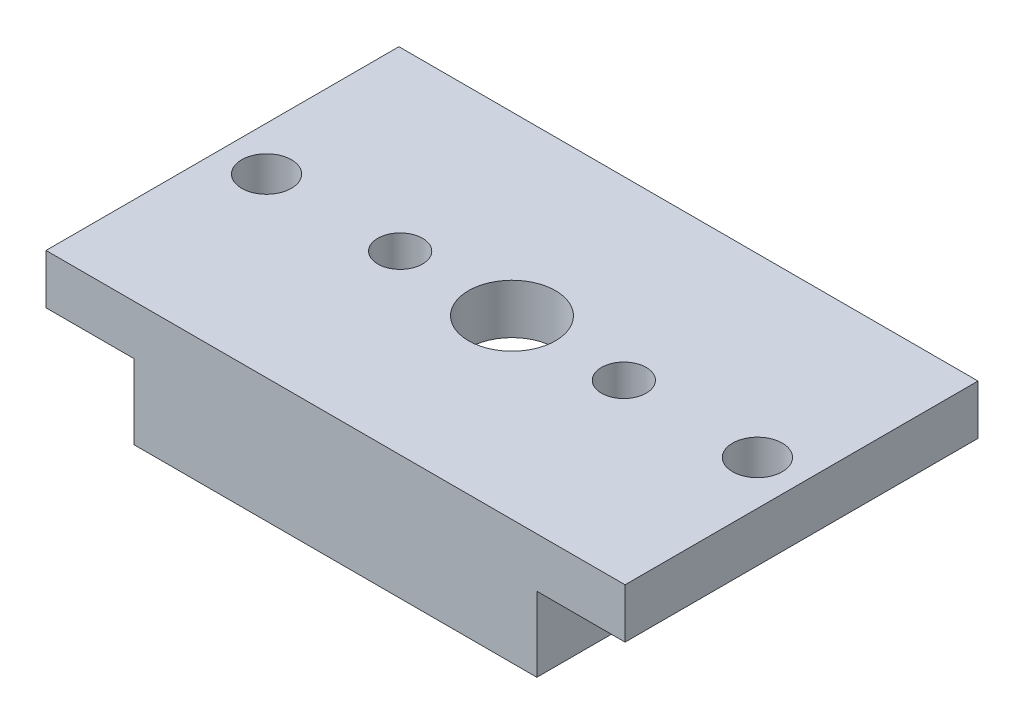
ISO-10303-21;
HEADER;
FILE_DESCRIPTION(('STEP AP214'),'2;1');
FILE_NAME('part.step','',(''),(''),'','','');
FILE_SCHEMA(('AUTOMOTIVE_DESIGN { 1 0 10303 214 1 1 1 1 }'));
ENDSEC;
DATA;
#1=APPLICATION_CONTEXT('core data for automotive mechanical design processes');
#2=APPLICATION_PROTOCOL_DEFINITION('international standard','automotive_design',2000,#1);
#3=PRODUCT_CONTEXT('',#1,'mechanical');
#4=PRODUCT('Part','Part','',(#3));
#5=PRODUCT_RELATED_PRODUCT_CATEGORY('part','',(#4));
#6=PRODUCT_DEFINITION_FORMATION('','',#4);
#7=PRODUCT_DEFINITION_CONTEXT('part definition',#1,'design');
#8=PRODUCT_DEFINITION('design','',#6,#7);
#9=PRODUCT_DEFINITION_SHAPE('','',#8);
#10=(LENGTH_UNIT() NAMED_UNIT(*) SI_UNIT(.MILLI.,.METRE.));
#11=(NAMED_UNIT(*) PLANE_ANGLE_UNIT() SI_UNIT($,.RADIAN.));
#12=(NAMED_UNIT(*) SI_UNIT($,.STERADIAN.) SOLID_ANGLE_UNIT());
#13=UNCERTAINTY_MEASURE_WITH_UNIT(LENGTH_MEASURE(1.E-05),#10,'distance_accuracy_value','');
#14=(GEOMETRIC_REPRESENTATION_CONTEXT(3) GLOBAL_UNCERTAINTY_ASSIGNED_CONTEXT((#13)) GLOBAL_UNIT_ASSIGNED_CONTEXT((#10,
#11,#12)) REPRESENTATION_CONTEXT('',''));
#15=CARTESIAN_POINT('',(0.,0.,0.));
#16=DIRECTION('',(0.,0.,1.));
#17=DIRECTION('',(1.,0.,0.));
#18=AXIS2_PLACEMENT_3D('',#15,#16,#17);
#19=CARTESIAN_POINT('',(-8.1,2.,7.1));
#20=DIRECTION('',(-1.,0.,0.));
#21=DIRECTION('',(0.,0.,1.));
#22=AXIS2_PLACEMENT_3D('',#19,#20,#21);
#23=PLANE('',#22);
#24=DIRECTION('',(0.,-1.,0.));
#25=VECTOR('',#24,1.);
#26=CARTESIAN_POINT('',(-8.1,2.,7.1));
#27=LINE('',#26,#25);
#28=CARTESIAN_POINT('',(-8.1,0.,7.1));
#29=VERTEX_POINT('',#28);
#30=CARTESIAN_POINT('',(-8.1,-3.,7.1));
#31=VERTEX_POINT('',#30);
#32=EDGE_CURVE('E12',#29,#31,#27,.T.);
#33=ORIENTED_EDGE('',*,*,#32,.F.);
#34=DIRECTION('',(0.,0.,-1.));
#35=VECTOR('',#34,1.);
#36=CARTESIAN_POINT('',(-8.1,0.,7.1));
#37=LINE('',#36,#35);
#38=CARTESIAN_POINT('',(-8.1,0.,-7.1));
#39=VERTEX_POINT('',#38);
#40=EDGE_CURVE('E104',#29,#39,#37,.T.);
#41=ORIENTED_EDGE('',*,*,#40,.T.);
#42=DIRECTION('',(0.,-1.,0.));
#43=VECTOR('',#42,1.);
#44=CARTESIAN_POINT('',(-8.1,2.,-7.1));
#45=LINE('',#44,#43);
#46=CARTESIAN_POINT('',(-8.1,-3.,-7.1));
#47=VERTEX_POINT('',#46);
#48=EDGE_CURVE('E89',#39,#47,#45,.T.);
#49=ORIENTED_EDGE('',*,*,#48,.T.);
#50=DIRECTION('',(0.,0.,-1.));
#51=VECTOR('',#50,1.);
#52=CARTESIAN_POINT('',(-8.1,-3.,0.));
#53=LINE('',#52,#51);
#54=EDGE_CURVE('E233',#31,#47,#53,.T.);
#55=ORIENTED_EDGE('',*,*,#54,.F.);
#56=EDGE_LOOP('',(#33,#41,#49,#55));
#57=FACE_BOUND('',#56,.T.);
#58=ADVANCED_FACE('F86',(#57),#23,.T.);
#59=CARTESIAN_POINT('',(8.1,2.,7.1));
#60=DIRECTION('',(-1.,0.,0.));
#61=DIRECTION('',(0.,0.,1.));
#62=AXIS2_PLACEMENT_3D('',#59,#60,#61);
#63=PLANE('',#62);
#64=DIRECTION('',(0.,0.,-1.));
#65=VECTOR('',#64,1.);
#66=CARTESIAN_POINT('',(8.1,0.,7.1));
#67=LINE('',#66,#65);
#68=CARTESIAN_POINT('',(8.1,0.,7.1));
#69=VERTEX_POINT('',#68);
#70=CARTESIAN_POINT('',(8.1,0.,-7.1));
#71=VERTEX_POINT('',#70);
#72=EDGE_CURVE('E191',#69,#71,#67,.T.);
#73=ORIENTED_EDGE('',*,*,#72,.F.);
#74=DIRECTION('',(0.,-1.,0.));
#75=VECTOR('',#74,1.);
#76=CARTESIAN_POINT('',(8.1,2.,7.1));
#77=LINE('',#76,#75);
#78=CARTESIAN_POINT('',(8.1,-3.,7.1));
#79=VERTEX_POINT('',#78);
#80=EDGE_CURVE('E94',#69,#79,#77,.T.);
#81=ORIENTED_EDGE('',*,*,#80,.T.);
#82=DIRECTION('',(0.,0.,-1.));
#83=VECTOR('',#82,1.);
#84=CARTESIAN_POINT('',(8.1,-3.,0.));
#85=LINE('',#84,#83);
#86=CARTESIAN_POINT('',(8.1,-3.,-7.1));
#87=VERTEX_POINT('',#86);
#88=EDGE_CURVE('E226',#79,#87,#85,.T.);
#89=ORIENTED_EDGE('',*,*,#88,.T.);
#90=DIRECTION('',(0.,-1.,0.));
#91=VECTOR('',#90,1.);
#92=CARTESIAN_POINT('',(8.1,2.,-7.1));
#93=LINE('',#92,#91);
#94=EDGE_CURVE('E288',#71,#87,#93,.T.);
#95=ORIENTED_EDGE('',*,*,#94,.F.);
#96=EDGE_LOOP('',(#73,#81,#89,#95));
#97=FACE_BOUND('',#96,.T.);
#98=ADVANCED_FACE('F311',(#97),#63,.F.);
#99=CARTESIAN_POINT('',(0.,2.,0.));
#100=DIRECTION('',(0.,-1.,0.));
#101=DIRECTION('',(0.,0.,-1.));
#102=AXIS2_PLACEMENT_3D('',#99,#100,#101);
#103=PLANE('',#102);
#104=CARTESIAN_POINT('',(9.875,2.,0.));
#105=DIRECTION('',(0.,-1.,0.));
#106=DIRECTION('',(0.,0.,-1.));
#107=AXIS2_PLACEMENT_3D('',#104,#105,#106);
#108=CIRCLE('',#107,1.);
#109=CARTESIAN_POINT('',(9.875,2.,-1.));
#110=VERTEX_POINT('',#109);
#111=EDGE_CURVE('E213',#110,#110,#108,.T.);
#112=ORIENTED_EDGE('',*,*,#111,.T.);
#113=EDGE_LOOP('',(#112));
#114=FACE_BOUND('',#113,.T.);
#115=CARTESIAN_POINT('',(-9.875,2.,0.));
#116=DIRECTION('',(0.,-1.,0.));
#117=DIRECTION('',(0.,0.,-1.));
#118=AXIS2_PLACEMENT_3D('',#115,#116,#117);
#119=CIRCLE('',#118,1.);
#120=CARTESIAN_POINT('',(-9.875,2.,-1.));
#121=VERTEX_POINT('',#120);
#122=EDGE_CURVE('E205',#121,#121,#119,.T.);
#123=ORIENTED_EDGE('',*,*,#122,.T.);
#124=EDGE_LOOP('',(#123));
#125=FACE_BOUND('',#124,.T.);
#126=DIRECTION('',(1.,0.,0.));
#127=VECTOR('',#126,1.);
#128=CARTESIAN_POINT('',(-8.1,2.,-7.1));
#129=LINE('',#128,#127);
#130=CARTESIAN_POINT('',(-11.65,2.,-7.1));
#131=VERTEX_POINT('',#130);
#132=CARTESIAN_POINT('',(11.65,2.,-7.1));
#133=VERTEX_POINT('',#132);
#134=EDGE_CURVE('E178',#131,#133,#129,.T.);
#135=ORIENTED_EDGE('',*,*,#134,.F.);
#136=DIRECTION('',(0.,0.,1.));
#137=VECTOR('',#136,1.);
#138=CARTESIAN_POINT('',(-11.65,2.,7.1));
#139=LINE('',#138,#137);
#140=CARTESIAN_POINT('',(-11.65,2.,7.1));
#141=VERTEX_POINT('',#140);
#142=EDGE_CURVE('E199',#131,#141,#139,.T.);
#143=ORIENTED_EDGE('',*,*,#142,.T.);
#144=DIRECTION('',(1.,0.,0.));
#145=VECTOR('',#144,1.);
#146=CARTESIAN_POINT('',(-8.1,2.,7.1));
#147=LINE('',#146,#145);
#148=CARTESIAN_POINT('',(11.65,2.,7.1));
#149=VERTEX_POINT('',#148);
#150=EDGE_CURVE('E286',#141,#149,#147,.T.);
#151=ORIENTED_EDGE('',*,*,#150,.T.);
#152=DIRECTION('',(0.,0.,-1.));
#153=VECTOR('',#152,1.);
#154=CARTESIAN_POINT('',(11.65,2.,7.1));
#155=LINE('',#154,#153);
#156=EDGE_CURVE('E202',#149,#133,#155,.T.);
#157=ORIENTED_EDGE('',*,*,#156,.T.);
#158=EDGE_LOOP('',(#135,#143,#151,#157));
#159=FACE_BOUND('',#158,.T.);
#160=CARTESIAN_POINT('',(-4.5,2.,0.));
#161=DIRECTION('',(0.,1.,0.));
#162=DIRECTION('',(0.,0.,1.));
#163=AXIS2_PLACEMENT_3D('',#160,#161,#162);
#164=CIRCLE('',#163,0.9);
#165=CARTESIAN_POINT('',(-4.5,2.,0.900000000000007));
#166=VERTEX_POINT('',#165);
#167=EDGE_CURVE('E268',#166,#166,#164,.T.);
#168=ORIENTED_EDGE('',*,*,#167,.F.);
#169=EDGE_LOOP('',(#168));
#170=FACE_BOUND('',#169,.T.);
#171=CARTESIAN_POINT('',(0.,2.,0.));
#172=DIRECTION('',(0.,1.,0.));
#173=DIRECTION('',(0.,0.,1.));
#174=AXIS2_PLACEMENT_3D('',#171,#172,#173);
#175=CIRCLE('',#174,1.75);
#176=CARTESIAN_POINT('',(0.,2.,1.75));
#177=VERTEX_POINT('',#176);
#178=EDGE_CURVE('E274',#177,#177,#175,.T.);
#179=ORIENTED_EDGE('',*,*,#178,.F.);
#180=EDGE_LOOP('',(#179));
#181=FACE_BOUND('',#180,.T.);
#182=CARTESIAN_POINT('',(4.5,2.,0.));
#183=DIRECTION('',(0.,1.,0.));
#184=DIRECTION('',(0.,0.,1.));
#185=AXIS2_PLACEMENT_3D('',#182,#183,#184);
#186=CIRCLE('',#185,0.899999999999999);
#187=CARTESIAN_POINT('',(4.5,2.,0.899999999999999));
#188=VERTEX_POINT('',#187);
#189=EDGE_CURVE('E280',#188,#188,#186,.T.);
#190=ORIENTED_EDGE('',*,*,#189,.F.);
#191=EDGE_LOOP('',(#190));
#192=FACE_BOUND('',#191,.T.);
#193=ADVANCED_FACE('F308',(#114,#125,#159,#170,#181,#192),#103,.F.);
#194=CARTESIAN_POINT('',(0.,0.,0.));
#195=DIRECTION('',(0.,-1.,0.));
#196=DIRECTION('',(0.,0.,-1.));
#197=AXIS2_PLACEMENT_3D('',#194,#195,#196);
#198=PLANE('',#197);
#199=DIRECTION('',(1.,0.,0.));
#200=VECTOR('',#199,1.);
#201=CARTESIAN_POINT('',(0.,0.,-5.1));
#202=LINE('',#201,#200);
#203=CARTESIAN_POINT('',(-6.1,0.,-5.1));
#204=VERTEX_POINT('',#203);
#205=CARTESIAN_POINT('',(6.1,0.,-5.1));
#206=VERTEX_POINT('',#205);
#207=EDGE_CURVE('E222',#204,#206,#202,.T.);
#208=ORIENTED_EDGE('',*,*,#207,.T.);
#209=DIRECTION('',(0.,0.,1.));
#210=VECTOR('',#209,1.);
#211=CARTESIAN_POINT('',(6.1,0.,0.));
#212=LINE('',#211,#210);
#213=CARTESIAN_POINT('',(6.1,0.,5.1));
#214=VERTEX_POINT('',#213);
#215=EDGE_CURVE('E249',#206,#214,#212,.T.);
#216=ORIENTED_EDGE('',*,*,#215,.T.);
#217=DIRECTION('',(1.,0.,0.));
#218=VECTOR('',#217,1.);
#219=CARTESIAN_POINT('',(0.,0.,5.1));
#220=LINE('',#219,#218);
#221=CARTESIAN_POINT('',(-6.1,0.,5.1));
#222=VERTEX_POINT('',#221);
#223=EDGE_CURVE('E251',#222,#214,#220,.T.);
#224=ORIENTED_EDGE('',*,*,#223,.F.);
#225=DIRECTION('',(0.,0.,1.));
#226=VECTOR('',#225,1.);
#227=CARTESIAN_POINT('',(-6.1,0.,0.));
#228=LINE('',#227,#226);
#229=EDGE_CURVE('E227',#204,#222,#228,.T.);
#230=ORIENTED_EDGE('',*,*,#229,.F.);
#231=EDGE_LOOP('',(#208,#216,#224,#230));
#232=FACE_BOUND('',#231,.T.);
#233=CARTESIAN_POINT('',(0.,0.,0.));
#234=DIRECTION('',(0.,1.,0.));
#235=DIRECTION('',(0.,0.,1.));
#236=AXIS2_PLACEMENT_3D('',#233,#234,#235);
#237=CIRCLE('',#236,1.75);
#238=CARTESIAN_POINT('',(0.,0.,1.75));
#239=VERTEX_POINT('',#238);
#240=EDGE_CURVE('E271',#239,#239,#237,.T.);
#241=ORIENTED_EDGE('',*,*,#240,.T.);
#242=EDGE_LOOP('',(#241));
#243=FACE_BOUND('',#242,.T.);
#244=CARTESIAN_POINT('',(4.5,0.,0.));
#245=DIRECTION('',(0.,1.,0.));
#246=DIRECTION('',(0.,0.,1.));
#247=AXIS2_PLACEMENT_3D('',#244,#245,#246);
#248=CIRCLE('',#247,0.899999999999999);
#249=CARTESIAN_POINT('',(4.5,0.,0.899999999999999));
#250=VERTEX_POINT('',#249);
#251=EDGE_CURVE('E277',#250,#250,#248,.T.);
#252=ORIENTED_EDGE('',*,*,#251,.T.);
#253=EDGE_LOOP('',(#252));
#254=FACE_BOUND('',#253,.T.);
#255=CARTESIAN_POINT('',(-4.5,0.,0.));
#256=DIRECTION('',(0.,1.,0.));
#257=DIRECTION('',(0.,0.,1.));
#258=AXIS2_PLACEMENT_3D('',#255,#256,#257);
#259=CIRCLE('',#258,0.9);
#260=CARTESIAN_POINT('',(-4.5,0.,0.900000000000007));
#261=VERTEX_POINT('',#260);
#262=EDGE_CURVE('E259',#261,#261,#259,.T.);
#263=ORIENTED_EDGE('',*,*,#262,.T.);
#264=EDGE_LOOP('',(#263));
#265=FACE_BOUND('',#264,.T.);
#266=ADVANCED_FACE('F319',(#232,#243,#254,#265),#198,.T.);
#267=CARTESIAN_POINT('',(-8.1,2.,7.1));
#268=DIRECTION('',(0.,0.,-1.));
#269=DIRECTION('',(-1.,0.,0.));
#270=AXIS2_PLACEMENT_3D('',#267,#268,#269);
#271=PLANE('',#270);
#272=ORIENTED_EDGE('',*,*,#150,.F.);
#273=DIRECTION('',(0.,1.,0.));
#274=VECTOR('',#273,1.);
#275=CARTESIAN_POINT('',(-11.65,0.,7.1));
#276=LINE('',#275,#274);
#277=CARTESIAN_POINT('',(-11.65,0.,7.1));
#278=VERTEX_POINT('',#277);
#279=EDGE_CURVE('E216',#278,#141,#276,.T.);
#280=ORIENTED_EDGE('',*,*,#279,.F.);
#281=DIRECTION('',(1.,0.,0.));
#282=VECTOR('',#281,1.);
#283=CARTESIAN_POINT('',(11.65,0.,7.1));
#284=LINE('',#283,#282);
#285=EDGE_CURVE('E184',#278,#29,#284,.T.);
#286=ORIENTED_EDGE('',*,*,#285,.T.);
#287=ORIENTED_EDGE('',*,*,#32,.T.);
#288=DIRECTION('',(1.,0.,0.));
#289=VECTOR('',#288,1.);
#290=CARTESIAN_POINT('',(0.,-3.,7.1));
#291=LINE('',#290,#289);
#292=EDGE_CURVE('E223',#31,#79,#291,.T.);
#293=ORIENTED_EDGE('',*,*,#292,.T.);
#294=ORIENTED_EDGE('',*,*,#80,.F.);
#295=CARTESIAN_POINT('',(11.65,0.,7.1));
#296=VERTEX_POINT('',#295);
#297=EDGE_CURVE('E210',#69,#296,#284,.T.);
#298=ORIENTED_EDGE('',*,*,#297,.T.);
#299=DIRECTION('',(0.,1.,0.));
#300=VECTOR('',#299,1.);
#301=CARTESIAN_POINT('',(11.65,0.,7.1));
#302=LINE('',#301,#300);
#303=EDGE_CURVE('E198',#296,#149,#302,.T.);
#304=ORIENTED_EDGE('',*,*,#303,.T.);
#305=EDGE_LOOP('',(#272,#280,#286,#287,#293,#294,#298,#304));
#306=FACE_BOUND('',#305,.T.);
#307=ADVANCED_FACE('F298',(#306),#271,.F.);
#308=CARTESIAN_POINT('',(-8.1,2.,-7.1));
#309=DIRECTION('',(0.,0.,-1.));
#310=DIRECTION('',(-1.,0.,0.));
#311=AXIS2_PLACEMENT_3D('',#308,#309,#310);
#312=PLANE('',#311);
#313=ORIENTED_EDGE('',*,*,#134,.T.);
#314=DIRECTION('',(0.,1.,0.));
#315=VECTOR('',#314,1.);
#316=CARTESIAN_POINT('',(11.65,0.,-7.1));
#317=LINE('',#316,#315);
#318=CARTESIAN_POINT('',(11.65,0.,-7.1));
#319=VERTEX_POINT('',#318);
#320=EDGE_CURVE('E172',#319,#133,#317,.T.);
#321=ORIENTED_EDGE('',*,*,#320,.F.);
#322=DIRECTION('',(-1.,0.,0.));
#323=VECTOR('',#322,1.);
#324=CARTESIAN_POINT('',(11.65,0.,-7.1));
#325=LINE('',#324,#323);
#326=EDGE_CURVE('E175',#319,#71,#325,.T.);
#327=ORIENTED_EDGE('',*,*,#326,.T.);
#328=ORIENTED_EDGE('',*,*,#94,.T.);
#329=DIRECTION('',(1.,0.,0.));
#330=VECTOR('',#329,1.);
#331=CARTESIAN_POINT('',(0.,-3.,-7.1));
#332=LINE('',#331,#330);
#333=EDGE_CURVE('E230',#47,#87,#332,.T.);
#334=ORIENTED_EDGE('',*,*,#333,.F.);
#335=ORIENTED_EDGE('',*,*,#48,.F.);
#336=CARTESIAN_POINT('',(-11.65,0.,-7.1));
#337=VERTEX_POINT('',#336);
#338=EDGE_CURVE('E193',#39,#337,#325,.T.);
#339=ORIENTED_EDGE('',*,*,#338,.T.);
#340=DIRECTION('',(0.,1.,0.));
#341=VECTOR('',#340,1.);
#342=CARTESIAN_POINT('',(-11.65,0.,-7.1));
#343=LINE('',#342,#341);
#344=EDGE_CURVE('E183',#337,#131,#343,.T.);
#345=ORIENTED_EDGE('',*,*,#344,.T.);
#346=EDGE_LOOP('',(#313,#321,#327,#328,#334,#335,#339,#345));
#347=FACE_BOUND('',#346,.T.);
#348=ADVANCED_FACE('F174',(#347),#312,.T.);
#349=CARTESIAN_POINT('',(4.5,2.,0.));
#350=DIRECTION('',(0.,-1.,0.));
#351=DIRECTION('',(0.,0.,-1.));
#352=AXIS2_PLACEMENT_3D('',#349,#350,#351);
#353=CYLINDRICAL_SURFACE('',#352,0.899999999999999);
#354=ORIENTED_EDGE('',*,*,#189,.T.);
#355=EDGE_LOOP('',(#354));
#356=FACE_BOUND('',#355,.T.);
#357=ORIENTED_EDGE('',*,*,#251,.F.);
#358=EDGE_LOOP('',(#357));
#359=FACE_BOUND('',#358,.T.);
#360=ADVANCED_FACE('F325',(#356,#359),#353,.F.);
#361=CARTESIAN_POINT('',(0.,2.,0.));
#362=DIRECTION('',(0.,-1.,0.));
#363=DIRECTION('',(0.,0.,-1.));
#364=AXIS2_PLACEMENT_3D('',#361,#362,#363);
#365=CYLINDRICAL_SURFACE('',#364,1.75);
#366=ORIENTED_EDGE('',*,*,#178,.T.);
#367=EDGE_LOOP('',(#366));
#368=FACE_BOUND('',#367,.T.);
#369=ORIENTED_EDGE('',*,*,#240,.F.);
#370=EDGE_LOOP('',(#369));
#371=FACE_BOUND('',#370,.T.);
#372=ADVANCED_FACE('F331',(#368,#371),#365,.F.);
#373=CARTESIAN_POINT('',(-4.5,2.,0.));
#374=DIRECTION('',(0.,-1.,0.));
#375=DIRECTION('',(0.,0.,-1.));
#376=AXIS2_PLACEMENT_3D('',#373,#374,#375);
#377=CYLINDRICAL_SURFACE('',#376,0.9);
#378=ORIENTED_EDGE('',*,*,#167,.T.);
#379=EDGE_LOOP('',(#378));
#380=FACE_BOUND('',#379,.T.);
#381=ORIENTED_EDGE('',*,*,#262,.F.);
#382=EDGE_LOOP('',(#381));
#383=FACE_BOUND('',#382,.T.);
#384=ADVANCED_FACE('F343',(#380,#383),#377,.F.);
#385=CARTESIAN_POINT('',(0.,-3.,-5.1));
#386=DIRECTION('',(0.,0.,1.));
#387=DIRECTION('',(1.,0.,0.));
#388=AXIS2_PLACEMENT_3D('',#385,#386,#387);
#389=PLANE('',#388);
#390=ORIENTED_EDGE('',*,*,#207,.F.);
#391=DIRECTION('',(0.,1.,0.));
#392=VECTOR('',#391,1.);
#393=CARTESIAN_POINT('',(-6.1,-3.,-5.1));
#394=LINE('',#393,#392);
#395=CARTESIAN_POINT('',(-6.1,-3.,-5.1));
#396=VERTEX_POINT('',#395);
#397=EDGE_CURVE('E256',#396,#204,#394,.T.);
#398=ORIENTED_EDGE('',*,*,#397,.F.);
#399=DIRECTION('',(1.,0.,0.));
#400=VECTOR('',#399,1.);
#401=CARTESIAN_POINT('',(0.,-3.,-5.1));
#402=LINE('',#401,#400);
#403=CARTESIAN_POINT('',(6.1,-3.,-5.1));
#404=VERTEX_POINT('',#403);
#405=EDGE_CURVE('E236',#396,#404,#402,.T.);
#406=ORIENTED_EDGE('',*,*,#405,.T.);
#407=DIRECTION('',(0.,1.,0.));
#408=VECTOR('',#407,1.);
#409=CARTESIAN_POINT('',(6.1,-3.,-5.1));
#410=LINE('',#409,#408);
#411=EDGE_CURVE('E247',#404,#206,#410,.T.);
#412=ORIENTED_EDGE('',*,*,#411,.T.);
#413=EDGE_LOOP('',(#390,#398,#406,#412));
#414=FACE_BOUND('',#413,.T.);
#415=ADVANCED_FACE('F347',(#414),#389,.T.);
#416=CARTESIAN_POINT('',(-6.1,-3.,0.));
#417=DIRECTION('',(-1.,0.,0.));
#418=DIRECTION('',(0.,0.,1.));
#419=AXIS2_PLACEMENT_3D('',#416,#417,#418);
#420=PLANE('',#419);
#421=ORIENTED_EDGE('',*,*,#229,.T.);
#422=DIRECTION('',(0.,1.,0.));
#423=VECTOR('',#422,1.);
#424=CARTESIAN_POINT('',(-6.1,-3.,5.1));
#425=LINE('',#424,#423);
#426=CARTESIAN_POINT('',(-6.1,-3.,5.1));
#427=VERTEX_POINT('',#426);
#428=EDGE_CURVE('E260',#427,#222,#425,.T.);
#429=ORIENTED_EDGE('',*,*,#428,.F.);
#430=DIRECTION('',(0.,0.,1.));
#431=VECTOR('',#430,1.);
#432=CARTESIAN_POINT('',(-6.1,-3.,0.));
#433=LINE('',#432,#431);
#434=EDGE_CURVE('E244',#396,#427,#433,.T.);
#435=ORIENTED_EDGE('',*,*,#434,.F.);
#436=ORIENTED_EDGE('',*,*,#397,.T.);
#437=EDGE_LOOP('',(#421,#429,#435,#436));
#438=FACE_BOUND('',#437,.T.);
#439=ADVANCED_FACE('F351',(#438),#420,.F.);
#440=CARTESIAN_POINT('',(0.,-3.,5.1));
#441=DIRECTION('',(0.,0.,1.));
#442=DIRECTION('',(1.,0.,0.));
#443=AXIS2_PLACEMENT_3D('',#440,#441,#442);
#444=PLANE('',#443);
#445=ORIENTED_EDGE('',*,*,#223,.T.);
#446=DIRECTION('',(0.,1.,0.));
#447=VECTOR('',#446,1.);
#448=CARTESIAN_POINT('',(6.1,-3.,5.1));
#449=LINE('',#448,#447);
#450=CARTESIAN_POINT('',(6.1,-3.,5.1));
#451=VERTEX_POINT('',#450);
#452=EDGE_CURVE('E263',#451,#214,#449,.T.);
#453=ORIENTED_EDGE('',*,*,#452,.F.);
#454=DIRECTION('',(1.,0.,0.));
#455=VECTOR('',#454,1.);
#456=CARTESIAN_POINT('',(0.,-3.,5.1));
#457=LINE('',#456,#455);
#458=EDGE_CURVE('E242',#427,#451,#457,.T.);
#459=ORIENTED_EDGE('',*,*,#458,.F.);
#460=ORIENTED_EDGE('',*,*,#428,.T.);
#461=EDGE_LOOP('',(#445,#453,#459,#460));
#462=FACE_BOUND('',#461,.T.);
#463=ADVANCED_FACE('F356',(#462),#444,.F.);
#464=CARTESIAN_POINT('',(6.1,-3.,0.));
#465=DIRECTION('',(-1.,0.,0.));
#466=DIRECTION('',(0.,0.,1.));
#467=AXIS2_PLACEMENT_3D('',#464,#465,#466);
#468=PLANE('',#467);
#469=ORIENTED_EDGE('',*,*,#215,.F.);
#470=ORIENTED_EDGE('',*,*,#411,.F.);
#471=DIRECTION('',(0.,0.,1.));
#472=VECTOR('',#471,1.);
#473=CARTESIAN_POINT('',(6.1,-3.,0.));
#474=LINE('',#473,#472);
#475=EDGE_CURVE('E239',#404,#451,#474,.T.);
#476=ORIENTED_EDGE('',*,*,#475,.T.);
#477=ORIENTED_EDGE('',*,*,#452,.T.);
#478=EDGE_LOOP('',(#469,#470,#476,#477));
#479=FACE_BOUND('',#478,.T.);
#480=ADVANCED_FACE('F353',(#479),#468,.T.);
#481=CARTESIAN_POINT('',(0.,-3.,0.));
#482=DIRECTION('',(0.,1.,0.));
#483=DIRECTION('',(0.,0.,1.));
#484=AXIS2_PLACEMENT_3D('',#481,#482,#483);
#485=PLANE('',#484);
#486=ORIENTED_EDGE('',*,*,#292,.F.);
#487=ORIENTED_EDGE('',*,*,#54,.T.);
#488=ORIENTED_EDGE('',*,*,#333,.T.);
#489=ORIENTED_EDGE('',*,*,#88,.F.);
#490=EDGE_LOOP('',(#486,#487,#488,#489));
#491=FACE_BOUND('',#490,.T.);
#492=ORIENTED_EDGE('',*,*,#405,.F.);
#493=ORIENTED_EDGE('',*,*,#434,.T.);
#494=ORIENTED_EDGE('',*,*,#458,.T.);
#495=ORIENTED_EDGE('',*,*,#475,.F.);
#496=EDGE_LOOP('',(#492,#493,#494,#495));
#497=FACE_BOUND('',#496,.T.);
#498=ADVANCED_FACE('F293',(#491,#497),#485,.F.);
#499=CARTESIAN_POINT('',(11.65,0.,7.1));
#500=DIRECTION('',(1.,0.,0.));
#501=DIRECTION('',(0.,0.,-1.));
#502=AXIS2_PLACEMENT_3D('',#499,#500,#501);
#503=PLANE('',#502);
#504=ORIENTED_EDGE('',*,*,#156,.F.);
#505=ORIENTED_EDGE('',*,*,#303,.F.);
#506=DIRECTION('',(0.,0.,-1.));
#507=VECTOR('',#506,1.);
#508=CARTESIAN_POINT('',(11.65,0.,7.1));
#509=LINE('',#508,#507);
#510=EDGE_CURVE('E189',#296,#319,#509,.T.);
#511=ORIENTED_EDGE('',*,*,#510,.T.);
#512=ORIENTED_EDGE('',*,*,#320,.T.);
#513=EDGE_LOOP('',(#504,#505,#511,#512));
#514=FACE_BOUND('',#513,.T.);
#515=ADVANCED_FACE('F196',(#514),#503,.T.);
#516=CARTESIAN_POINT('',(0.,0.,0.));
#517=DIRECTION('',(0.,1.,0.));
#518=DIRECTION('',(0.,0.,1.));
#519=AXIS2_PLACEMENT_3D('',#516,#517,#518);
#520=PLANE('',#519);
#521=CARTESIAN_POINT('',(9.875,0.,0.));
#522=DIRECTION('',(0.,-1.,0.));
#523=DIRECTION('',(0.,0.,-1.));
#524=AXIS2_PLACEMENT_3D('',#521,#522,#523);
#525=CIRCLE('',#524,1.);
#526=CARTESIAN_POINT('',(9.875,0.,-1.));
#527=VERTEX_POINT('',#526);
#528=EDGE_CURVE('E386',#527,#527,#525,.T.);
#529=ORIENTED_EDGE('',*,*,#528,.F.);
#530=EDGE_LOOP('',(#529));
#531=FACE_BOUND('',#530,.T.);
#532=ORIENTED_EDGE('',*,*,#297,.F.);
#533=ORIENTED_EDGE('',*,*,#72,.T.);
#534=ORIENTED_EDGE('',*,*,#326,.F.);
#535=ORIENTED_EDGE('',*,*,#510,.F.);
#536=EDGE_LOOP('',(#532,#533,#534,#535));
#537=FACE_BOUND('',#536,.T.);
#538=ADVANCED_FACE('F188',(#531,#537),#520,.F.);
#539=CARTESIAN_POINT('',(-11.65,0.,7.1));
#540=DIRECTION('',(-1.,0.,0.));
#541=DIRECTION('',(0.,0.,1.));
#542=AXIS2_PLACEMENT_3D('',#539,#540,#541);
#543=PLANE('',#542);
#544=ORIENTED_EDGE('',*,*,#142,.F.);
#545=ORIENTED_EDGE('',*,*,#344,.F.);
#546=DIRECTION('',(0.,0.,1.));
#547=VECTOR('',#546,1.);
#548=CARTESIAN_POINT('',(-11.65,0.,7.1));
#549=LINE('',#548,#547);
#550=EDGE_CURVE('E192',#337,#278,#549,.T.);
#551=ORIENTED_EDGE('',*,*,#550,.T.);
#552=ORIENTED_EDGE('',*,*,#279,.T.);
#553=EDGE_LOOP('',(#544,#545,#551,#552));
#554=FACE_BOUND('',#553,.T.);
#555=ADVANCED_FACE('F306',(#554),#543,.T.);
#556=CARTESIAN_POINT('',(-9.875,0.,0.));
#557=DIRECTION('',(0.,-1.,0.));
#558=DIRECTION('',(0.,0.,-1.));
#559=AXIS2_PLACEMENT_3D('',#556,#557,#558);
#560=CIRCLE('',#559,1.);
#561=CARTESIAN_POINT('',(-9.875,0.,-1.));
#562=VERTEX_POINT('',#561);
#563=EDGE_CURVE('E388',#562,#562,#560,.T.);
#564=ORIENTED_EDGE('',*,*,#563,.F.);
#565=EDGE_LOOP('',(#564));
#566=FACE_BOUND('',#565,.T.);
#567=ORIENTED_EDGE('',*,*,#40,.F.);
#568=ORIENTED_EDGE('',*,*,#285,.F.);
#569=ORIENTED_EDGE('',*,*,#550,.F.);
#570=ORIENTED_EDGE('',*,*,#338,.F.);
#571=EDGE_LOOP('',(#567,#568,#569,#570));
#572=FACE_BOUND('',#571,.T.);
#573=ADVANCED_FACE('F302',(#566,#572),#520,.F.);
#574=CARTESIAN_POINT('',(-9.875,2.,0.));
#575=DIRECTION('',(0.,-1.,0.));
#576=DIRECTION('',(0.,0.,-1.));
#577=AXIS2_PLACEMENT_3D('',#574,#575,#576);
#578=CYLINDRICAL_SURFACE('',#577,1.);
#579=ORIENTED_EDGE('',*,*,#122,.F.);
#580=EDGE_LOOP('',(#579));
#581=FACE_BOUND('',#580,.T.);
#582=ORIENTED_EDGE('',*,*,#563,.T.);
#583=EDGE_LOOP('',(#582));
#584=FACE_BOUND('',#583,.T.);
#585=ADVANCED_FACE('F371',(#581,#584),#578,.F.);
#586=CARTESIAN_POINT('',(9.875,2.,0.));
#587=DIRECTION('',(0.,-1.,0.));
#588=DIRECTION('',(0.,0.,-1.));
#589=AXIS2_PLACEMENT_3D('',#586,#587,#588);
#590=CYLINDRICAL_SURFACE('',#589,1.);
#591=ORIENTED_EDGE('',*,*,#111,.F.);
#592=EDGE_LOOP('',(#591));
#593=FACE_BOUND('',#592,.T.);
#594=ORIENTED_EDGE('',*,*,#528,.T.);
#595=EDGE_LOOP('',(#594));
#596=FACE_BOUND('',#595,.T.);
#597=ADVANCED_FACE('F375',(#593,#596),#590,.F.);
#598=CLOSED_SHELL('',(#58,#98,#193,#266,#307,#348,#360,#372,#384,#415,#439,#463,#480,#498,#515,
#538,#555,#573,#585,#597));
#599=MANIFOLD_SOLID_BREP('B2',#598);
#600=ADVANCED_BREP_SHAPE_REPRESENTATION('',(#18,#599),#14);
#601=SHAPE_DEFINITION_REPRESENTATION(#9,#600);
ENDSEC;
END-ISO-10303-21;
